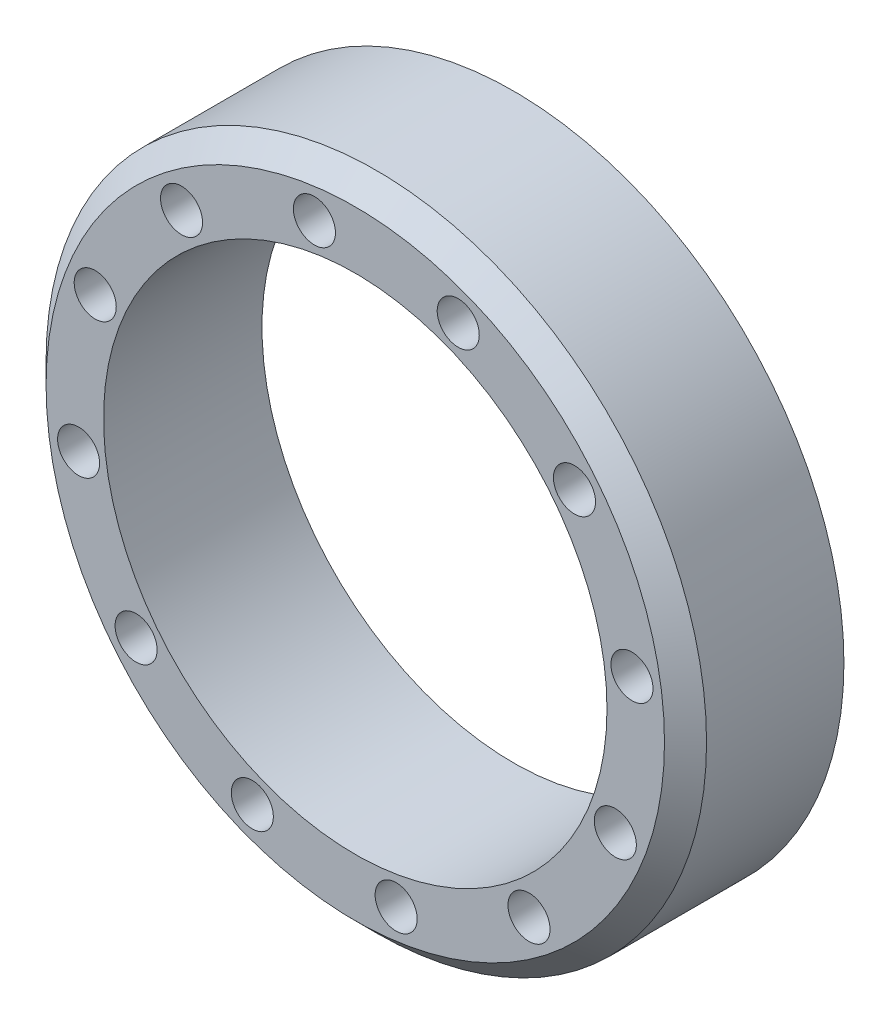
ISO-10303-21;
HEADER;
FILE_DESCRIPTION(('STEP AP214'),'2;1');
FILE_NAME('part.step','',(''),(''),'','','');
FILE_SCHEMA(('AUTOMOTIVE_DESIGN { 1 0 10303 214 1 1 1 1 }'));
ENDSEC;
DATA;
#1=APPLICATION_CONTEXT('core data for automotive mechanical design processes');
#2=APPLICATION_PROTOCOL_DEFINITION('international standard','automotive_design',2000,#1);
#3=PRODUCT_CONTEXT('',#1,'mechanical');
#4=PRODUCT('Part','Part','',(#3));
#5=PRODUCT_RELATED_PRODUCT_CATEGORY('part','',(#4));
#6=PRODUCT_DEFINITION_FORMATION('','',#4);
#7=PRODUCT_DEFINITION_CONTEXT('part definition',#1,'design');
#8=PRODUCT_DEFINITION('design','',#6,#7);
#9=PRODUCT_DEFINITION_SHAPE('','',#8);
#10=(LENGTH_UNIT() NAMED_UNIT(*) SI_UNIT(.MILLI.,.METRE.));
#11=(NAMED_UNIT(*) PLANE_ANGLE_UNIT() SI_UNIT($,.RADIAN.));
#12=(NAMED_UNIT(*) SI_UNIT($,.STERADIAN.) SOLID_ANGLE_UNIT());
#13=UNCERTAINTY_MEASURE_WITH_UNIT(LENGTH_MEASURE(1.E-05),#10,'distance_accuracy_value','');
#14=(GEOMETRIC_REPRESENTATION_CONTEXT(3) GLOBAL_UNCERTAINTY_ASSIGNED_CONTEXT((#13)) GLOBAL_UNIT_ASSIGNED_CONTEXT((#10,
#11,#12)) REPRESENTATION_CONTEXT('',''));
#15=CARTESIAN_POINT('',(0.,0.,0.));
#16=DIRECTION('',(0.,0.,1.));
#17=DIRECTION('',(1.,0.,0.));
#18=AXIS2_PLACEMENT_3D('',#15,#16,#17);
#19=CARTESIAN_POINT('',(5.13813615685674,1294.42321463531,641.616173979208));
#20=DIRECTION('',(0.,0.,1.));
#21=DIRECTION('',(1.,0.,0.));
#22=AXIS2_PLACEMENT_3D('',#19,#20,#21);
#23=CONICAL_SURFACE('',#22,0.,1.02974425869508);
#24=CARTESIAN_POINT('',(5.13813615685674,1294.42321463531,641.616173979208));
#25=VERTEX_POINT('',#24);
#26=VERTEX_LOOP('',#25);
#27=FACE_BOUND('',#26,.T.);
#28=CARTESIAN_POINT('',(5.13813615685674,1294.42321463531,643.050788793234));
#29=DIRECTION('',(0.,0.,1.));
#30=DIRECTION('',(0.,1.,0.));
#31=AXIS2_PLACEMENT_3D('',#28,#29,#30);
#32=CIRCLE('',#31,2.3875999999996);
#33=CARTESIAN_POINT('',(5.13813615685674,1296.81081463531,643.050788793234));
#34=VERTEX_POINT('',#33);
#35=EDGE_CURVE('E70',#34,#34,#32,.F.);
#36=ORIENTED_EDGE('',*,*,#35,.F.);
#37=EDGE_LOOP('',(#36));
#38=FACE_BOUND('',#37,.T.);
#39=ADVANCED_FACE('F17',(#27,#38),#23,.F.);
#40=CARTESIAN_POINT('',(20.2214420238372,1300.95034393688,641.616173979208));
#41=DIRECTION('',(0.,0.,1.));
#42=DIRECTION('',(1.,0.,0.));
#43=AXIS2_PLACEMENT_3D('',#40,#41,#42);
#44=CONICAL_SURFACE('',#43,0.,1.02974425869112);
#45=CARTESIAN_POINT('',(20.2214420238372,1300.95034393688,641.616173979208));
#46=VERTEX_POINT('',#45);
#47=VERTEX_LOOP('',#46);
#48=FACE_BOUND('',#47,.T.);
#49=CARTESIAN_POINT('',(20.2214420238372,1300.95034393688,643.050788793234));
#50=DIRECTION('',(0.,0.,1.));
#51=DIRECTION('',(-0.500000000026422,0.866025403769184,0.));
#52=AXIS2_PLACEMENT_3D('',#49,#50,#51);
#53=CIRCLE('',#52,2.38759999987383);
#54=CARTESIAN_POINT('',(19.0276420238372,1303.01806619081,643.050788793234));
#55=VERTEX_POINT('',#54);
#56=EDGE_CURVE('E72',#55,#55,#53,.F.);
#57=ORIENTED_EDGE('',*,*,#56,.F.);
#58=EDGE_LOOP('',(#57));
#59=FACE_BOUND('',#58,.T.);
#60=ADVANCED_FACE('F66',(#48,#59),#44,.F.);
#61=CARTESIAN_POINT('',(30.020403426942,1314.1446566592,641.616173979208));
#62=DIRECTION('',(0.,0.,1.));
#63=DIRECTION('',(0.,-1.,0.));
#64=AXIS2_PLACEMENT_3D('',#61,#62,#63);
#65=CONICAL_SURFACE('',#64,0.,1.02974425870344);
#66=CARTESIAN_POINT('',(30.020403426942,1314.1446566592,641.616173979208));
#67=VERTEX_POINT('',#66);
#68=VERTEX_LOOP('',#67);
#69=FACE_BOUND('',#68,.T.);
#70=CARTESIAN_POINT('',(30.020403426942,1314.1446566592,643.050788793234));
#71=DIRECTION('',(0.,0.,1.));
#72=DIRECTION('',(-0.866025403782515,0.500000000003332,0.));
#73=AXIS2_PLACEMENT_3D('',#70,#71,#72);
#74=CIRCLE('',#73,2.38759999998369);
#75=CARTESIAN_POINT('',(27.952681172885,1315.3384566592,643.050788793234));
#76=VERTEX_POINT('',#75);
#77=EDGE_CURVE('E75',#76,#76,#74,.F.);
#78=ORIENTED_EDGE('',*,*,#77,.F.);
#79=EDGE_LOOP('',(#78));
#80=FACE_BOUND('',#79,.T.);
#81=ADVANCED_FACE('F160',(#69,#80),#65,.F.);
#82=CARTESIAN_POINT('',(31.9093965715796,1330.47074736383,641.616173979208));
#83=DIRECTION('',(0.,0.,1.));
#84=DIRECTION('',(0.,-1.,0.));
#85=AXIS2_PLACEMENT_3D('',#82,#83,#84);
#86=CONICAL_SURFACE('',#85,0.,1.0297442587086);
#87=CARTESIAN_POINT('',(31.9093965715796,1330.47074736383,641.616173979208));
#88=VERTEX_POINT('',#87);
#89=VERTEX_LOOP('',#88);
#90=FACE_BOUND('',#89,.T.);
#91=CARTESIAN_POINT('',(31.9093965715796,1330.47074736383,643.050788793234));
#92=DIRECTION('',(0.,0.,1.));
#93=DIRECTION('',(-1.,0.,0.));
#94=AXIS2_PLACEMENT_3D('',#91,#92,#93);
#95=CIRCLE('',#94,2.3876);
#96=CARTESIAN_POINT('',(29.5217965715796,1330.47074736383,643.050788793234));
#97=VERTEX_POINT('',#96);
#98=EDGE_CURVE('E152',#97,#97,#95,.F.);
#99=ORIENTED_EDGE('',*,*,#98,.F.);
#100=EDGE_LOOP('',(#99));
#101=FACE_BOUND('',#100,.T.);
#102=ADVANCED_FACE('F162',(#90,#101),#86,.F.);
#103=CARTESIAN_POINT('',(25.382267270096,1345.55405323068,641.616173979208));
#104=DIRECTION('',(0.,0.,1.));
#105=DIRECTION('',(0.,-1.,0.));
#106=AXIS2_PLACEMENT_3D('',#103,#104,#105);
#107=CONICAL_SURFACE('',#106,0.,1.02974425870461);
#108=CARTESIAN_POINT('',(25.382267270096,1345.55405323068,641.616173979208));
#109=VERTEX_POINT('',#108);
#110=VERTEX_LOOP('',#109);
#111=FACE_BOUND('',#110,.T.);
#112=CARTESIAN_POINT('',(25.382267270096,1345.55405323068,643.050788793234));
#113=DIRECTION('',(0.,0.,1.));
#114=DIRECTION('',(-0.866025403784642,-0.499999999999648,0.));
#115=AXIS2_PLACEMENT_3D('',#112,#113,#114);
#116=CIRCLE('',#115,2.38760000000128);
#117=CARTESIAN_POINT('',(23.3145450160186,1344.36025323068,643.050788793234));
#118=VERTEX_POINT('',#117);
#119=EDGE_CURVE('E149',#118,#118,#116,.F.);
#120=ORIENTED_EDGE('',*,*,#119,.F.);
#121=EDGE_LOOP('',(#120));
#122=FACE_BOUND('',#121,.T.);
#123=ADVANCED_FACE('F170',(#111,#122),#107,.F.);
#124=CARTESIAN_POINT('',(12.1879545477379,1355.35301463374,641.616173979208));
#125=DIRECTION('',(0.,0.,1.));
#126=DIRECTION('',(1.,0.,0.));
#127=AXIS2_PLACEMENT_3D('',#124,#125,#126);
#128=CONICAL_SURFACE('',#127,0.,1.02974425869114);
#129=CARTESIAN_POINT('',(12.1879545477378,1355.35301463374,641.616173979208));
#130=VERTEX_POINT('',#129);
#131=VERTEX_LOOP('',#130);
#132=FACE_BOUND('',#131,.T.);
#133=CARTESIAN_POINT('',(12.1879545477379,1355.35301463374,643.050788793234));
#134=DIRECTION('',(0.,0.,1.));
#135=DIRECTION('',(-0.500000000026342,-0.86602540376923,0.));
#136=AXIS2_PLACEMENT_3D('',#133,#134,#135);
#137=CIRCLE('',#136,2.38759999987422);
#138=CARTESIAN_POINT('',(10.9941545477379,1353.28529237981,643.050788793234));
#139=VERTEX_POINT('',#138);
#140=EDGE_CURVE('E146',#139,#139,#137,.F.);
#141=ORIENTED_EDGE('',*,*,#140,.F.);
#142=EDGE_LOOP('',(#141));
#143=FACE_BOUND('',#142,.T.);
#144=ADVANCED_FACE('F269',(#132,#143),#128,.F.);
#145=CARTESIAN_POINT('',(-4.13813615685566,1357.24200777853,641.616173979208));
#146=DIRECTION('',(0.,0.,1.));
#147=DIRECTION('',(1.,0.,0.));
#148=AXIS2_PLACEMENT_3D('',#145,#146,#147);
#149=CONICAL_SURFACE('',#148,0.,1.02974425874);
#150=CARTESIAN_POINT('',(-4.13813615685566,1357.24200777853,641.616173979208));
#151=VERTEX_POINT('',#150);
#152=VERTEX_LOOP('',#151);
#153=FACE_BOUND('',#152,.T.);
#154=CARTESIAN_POINT('',(-4.13813615685566,1357.24200777853,643.050788793234));
#155=DIRECTION('',(0.,0.,1.));
#156=DIRECTION('',(0.,-1.,0.));
#157=AXIS2_PLACEMENT_3D('',#154,#155,#156);
#158=CIRCLE('',#157,2.38760000000027);
#159=CARTESIAN_POINT('',(-4.13813615685566,1354.85440777853,643.050788793234));
#160=VERTEX_POINT('',#159);
#161=EDGE_CURVE('E143',#160,#160,#158,.F.);
#162=ORIENTED_EDGE('',*,*,#161,.F.);
#163=EDGE_LOOP('',(#162));
#164=FACE_BOUND('',#163,.T.);
#165=ADVANCED_FACE('F265',(#153,#164),#149,.F.);
#166=CARTESIAN_POINT('',(-19.2214420238361,1350.71487847696,641.616173979208));
#167=DIRECTION('',(0.,0.,1.));
#168=DIRECTION('',(1.,0.,0.));
#169=AXIS2_PLACEMENT_3D('',#166,#167,#168);
#170=CONICAL_SURFACE('',#169,0.,1.02974425869106);
#171=CARTESIAN_POINT('',(-19.2214420238361,1350.71487847696,641.616173979208));
#172=VERTEX_POINT('',#171);
#173=VERTEX_LOOP('',#172);
#174=FACE_BOUND('',#173,.T.);
#175=CARTESIAN_POINT('',(-19.2214420238361,1350.71487847696,643.050788793234));
#176=DIRECTION('',(0.,0.,1.));
#177=DIRECTION('',(0.499999999980354,-0.866025403795781,0.));
#178=AXIS2_PLACEMENT_3D('',#175,#176,#177);
#179=CIRCLE('',#178,2.38760000009382);
#180=CARTESIAN_POINT('',(-18.0276420238361,1348.64715622277,643.050788793234));
#181=VERTEX_POINT('',#180);
#182=EDGE_CURVE('E140',#181,#181,#179,.F.);
#183=ORIENTED_EDGE('',*,*,#182,.F.);
#184=EDGE_LOOP('',(#183));
#185=FACE_BOUND('',#184,.T.);
#186=ADVANCED_FACE('F261',(#174,#185),#170,.F.);
#187=CARTESIAN_POINT('',(-29.020403426946,1337.52056575464,641.616173979208));
#188=DIRECTION('',(0.,0.,1.));
#189=DIRECTION('',(0.,-1.,0.));
#190=AXIS2_PLACEMENT_3D('',#187,#188,#189);
#191=CONICAL_SURFACE('',#190,0.,1.02974425870345);
#192=CARTESIAN_POINT('',(-29.020403426946,1337.52056575464,641.616173979208));
#193=VERTEX_POINT('',#192);
#194=VERTEX_LOOP('',#193);
#195=FACE_BOUND('',#194,.T.);
#196=CARTESIAN_POINT('',(-29.020403426946,1337.52056575464,643.050788793234));
#197=DIRECTION('',(0.,0.,1.));
#198=DIRECTION('',(0.866025403785135,-0.499999999998793,0.));
#199=AXIS2_PLACEMENT_3D('',#196,#197,#198);
#200=CIRCLE('',#199,2.38760000000581);
#201=CARTESIAN_POINT('',(-26.9526811728636,1336.32676575464,643.050788793234));
#202=VERTEX_POINT('',#201);
#203=EDGE_CURVE('E137',#202,#202,#200,.F.);
#204=ORIENTED_EDGE('',*,*,#203,.F.);
#205=EDGE_LOOP('',(#204));
#206=FACE_BOUND('',#205,.T.);
#207=ADVANCED_FACE('F257',(#195,#206),#191,.F.);
#208=CARTESIAN_POINT('',(-30.9093965715836,1321.19447505001,641.616173979208));
#209=DIRECTION('',(0.,0.,1.));
#210=DIRECTION('',(0.,-1.,0.));
#211=AXIS2_PLACEMENT_3D('',#208,#209,#210);
#212=CONICAL_SURFACE('',#211,0.,1.02974425870859);
#213=CARTESIAN_POINT('',(-30.9093965715836,1321.19447505001,641.616173979208));
#214=VERTEX_POINT('',#213);
#215=VERTEX_LOOP('',#214);
#216=FACE_BOUND('',#215,.T.);
#217=CARTESIAN_POINT('',(-30.9093965715836,1321.19447505001,643.050788793234));
#218=DIRECTION('',(0.,0.,1.));
#219=DIRECTION('',(1.,0.,0.));
#220=AXIS2_PLACEMENT_3D('',#217,#218,#219);
#221=CIRCLE('',#220,2.3876);
#222=CARTESIAN_POINT('',(-28.5217965715836,1321.19447505001,643.050788793234));
#223=VERTEX_POINT('',#222);
#224=EDGE_CURVE('E131',#223,#223,#221,.F.);
#225=ORIENTED_EDGE('',*,*,#224,.F.);
#226=EDGE_LOOP('',(#225));
#227=FACE_BOUND('',#226,.T.);
#228=ADVANCED_FACE('F253',(#216,#227),#212,.F.);
#229=CARTESIAN_POINT('',(-24.3822672700949,1306.1111691829,641.616173979208));
#230=DIRECTION('',(0.,0.,1.));
#231=DIRECTION('',(1.,0.,0.));
#232=AXIS2_PLACEMENT_3D('',#229,#230,#231);
#233=CONICAL_SURFACE('',#232,0.,1.02974425872703);
#234=CARTESIAN_POINT('',(-24.3822672700949,1306.1111691829,641.616173979208));
#235=VERTEX_POINT('',#234);
#236=VERTEX_LOOP('',#235);
#237=FACE_BOUND('',#236,.T.);
#238=CARTESIAN_POINT('',(-24.3822672700949,1306.1111691829,643.050788793234));
#239=DIRECTION('',(0.,0.,1.));
#240=DIRECTION('',(0.866025403784296,0.500000000000248,0.));
#241=AXIS2_PLACEMENT_3D('',#238,#239,#240);
#242=CIRCLE('',#241,2.38759999999931);
#243=CARTESIAN_POINT('',(-22.3145450160201,1307.3049691829,643.050788793234));
#244=VERTEX_POINT('',#243);
#245=EDGE_CURVE('E126',#244,#244,#242,.F.);
#246=ORIENTED_EDGE('',*,*,#245,.F.);
#247=EDGE_LOOP('',(#246));
#248=FACE_BOUND('',#247,.T.);
#249=ADVANCED_FACE('F250',(#237,#248),#233,.F.);
#250=CARTESIAN_POINT('',(-11.1879545477393,1296.31220777985,641.616173979208));
#251=DIRECTION('',(0.,0.,1.));
#252=DIRECTION('',(1.,0.,0.));
#253=AXIS2_PLACEMENT_3D('',#250,#251,#252);
#254=CONICAL_SURFACE('',#253,0.,1.02974425873015);
#255=CARTESIAN_POINT('',(-11.1879545477393,1296.31220777985,641.616173979208));
#256=VERTEX_POINT('',#255);
#257=VERTEX_LOOP('',#256);
#258=FACE_BOUND('',#257,.T.);
#259=CARTESIAN_POINT('',(-11.1879545477393,1296.31220777985,643.050788793234));
#260=DIRECTION('',(0.,0.,1.));
#261=DIRECTION('',(0.499999999980354,0.866025403795781,0.));
#262=AXIS2_PLACEMENT_3D('',#259,#260,#261);
#263=CIRCLE('',#262,2.38760000009382);
#264=CARTESIAN_POINT('',(-9.99415454773932,1298.37993003403,643.050788793234));
#265=VERTEX_POINT('',#264);
#266=EDGE_CURVE('E122',#265,#265,#263,.F.);
#267=ORIENTED_EDGE('',*,*,#266,.F.);
#268=EDGE_LOOP('',(#267));
#269=FACE_BOUND('',#268,.T.);
#270=ADVANCED_FACE('F247',(#258,#269),#254,.F.);
#271=CARTESIAN_POINT('',(5.13813615685674,1294.42321463531,643.050788793234));
#272=DIRECTION('',(0.,0.,1.));
#273=DIRECTION('',(1.,0.,0.));
#274=AXIS2_PLACEMENT_3D('',#271,#272,#273);
#275=CYLINDRICAL_SURFACE('',#274,2.38759999999982);
#276=ORIENTED_EDGE('',*,*,#35,.T.);
#277=EDGE_LOOP('',(#276));
#278=FACE_BOUND('',#277,.T.);
#279=CARTESIAN_POINT('',(5.13813615685674,1294.42321463531,654.150588793234));
#280=DIRECTION('',(0.,0.,1.));
#281=DIRECTION('',(1.,0.,0.));
#282=AXIS2_PLACEMENT_3D('',#279,#280,#281);
#283=CIRCLE('',#282,2.38759999999982);
#284=CARTESIAN_POINT('',(7.52573615685656,1294.42321463531,654.150588793234));
#285=VERTEX_POINT('',#284);
#286=EDGE_CURVE('E117',#285,#285,#283,.F.);
#287=ORIENTED_EDGE('',*,*,#286,.F.);
#288=EDGE_LOOP('',(#287));
#289=FACE_BOUND('',#288,.T.);
#290=ADVANCED_FACE('F243',(#278,#289),#275,.F.);
#291=CARTESIAN_POINT('',(20.2214420238372,1300.95034393688,643.050788793234));
#292=DIRECTION('',(0.,0.,1.));
#293=DIRECTION('',(1.,0.,0.));
#294=AXIS2_PLACEMENT_3D('',#291,#292,#293);
#295=CYLINDRICAL_SURFACE('',#294,2.38759999987383);
#296=ORIENTED_EDGE('',*,*,#56,.T.);
#297=EDGE_LOOP('',(#296));
#298=FACE_BOUND('',#297,.T.);
#299=CARTESIAN_POINT('',(20.2214420238372,1300.95034393688,654.150588793234));
#300=DIRECTION('',(0.,0.,1.));
#301=DIRECTION('',(1.,0.,0.));
#302=AXIS2_PLACEMENT_3D('',#299,#300,#301);
#303=CIRCLE('',#302,2.38759999987383);
#304=CARTESIAN_POINT('',(22.609042023711,1300.95034393688,654.150588793234));
#305=VERTEX_POINT('',#304);
#306=EDGE_CURVE('E115',#305,#305,#303,.F.);
#307=ORIENTED_EDGE('',*,*,#306,.F.);
#308=EDGE_LOOP('',(#307));
#309=FACE_BOUND('',#308,.T.);
#310=ADVANCED_FACE('F240',(#298,#309),#295,.F.);
#311=CARTESIAN_POINT('',(30.020403426942,1314.1446566592,643.050788793234));
#312=DIRECTION('',(0.,0.,1.));
#313=DIRECTION('',(1.,0.,0.));
#314=AXIS2_PLACEMENT_3D('',#311,#312,#313);
#315=CYLINDRICAL_SURFACE('',#314,2.3875999999838);
#316=ORIENTED_EDGE('',*,*,#77,.T.);
#317=EDGE_LOOP('',(#316));
#318=FACE_BOUND('',#317,.T.);
#319=CARTESIAN_POINT('',(30.020403426942,1314.1446566592,654.150588793234));
#320=DIRECTION('',(0.,0.,1.));
#321=DIRECTION('',(1.,0.,0.));
#322=AXIS2_PLACEMENT_3D('',#319,#320,#321);
#323=CIRCLE('',#322,2.3875999999838);
#324=CARTESIAN_POINT('',(32.4080034269258,1314.1446566592,654.150588793234));
#325=VERTEX_POINT('',#324);
#326=EDGE_CURVE('E112',#325,#325,#323,.F.);
#327=ORIENTED_EDGE('',*,*,#326,.F.);
#328=EDGE_LOOP('',(#327));
#329=FACE_BOUND('',#328,.T.);
#330=ADVANCED_FACE('F157',(#318,#329),#315,.F.);
#331=CARTESIAN_POINT('',(31.9093965715796,1330.47074736383,643.050788793234));
#332=DIRECTION('',(0.,0.,1.));
#333=DIRECTION('',(1.,0.,0.));
#334=AXIS2_PLACEMENT_3D('',#331,#332,#333);
#335=CYLINDRICAL_SURFACE('',#334,2.3876);
#336=ORIENTED_EDGE('',*,*,#98,.T.);
#337=EDGE_LOOP('',(#336));
#338=FACE_BOUND('',#337,.T.);
#339=CARTESIAN_POINT('',(31.9093965715796,1330.47074736383,654.150588793234));
#340=DIRECTION('',(0.,0.,1.));
#341=DIRECTION('',(1.,0.,0.));
#342=AXIS2_PLACEMENT_3D('',#339,#340,#341);
#343=CIRCLE('',#342,2.3876);
#344=CARTESIAN_POINT('',(34.2969965715796,1330.47074736383,654.150588793234));
#345=VERTEX_POINT('',#344);
#346=EDGE_CURVE('E109',#345,#345,#343,.F.);
#347=ORIENTED_EDGE('',*,*,#346,.F.);
#348=EDGE_LOOP('',(#347));
#349=FACE_BOUND('',#348,.T.);
#350=ADVANCED_FACE('F233',(#338,#349),#335,.F.);
#351=CARTESIAN_POINT('',(25.382267270096,1345.55405323068,643.050788793234));
#352=DIRECTION('',(0.,0.,1.));
#353=DIRECTION('',(1.,0.,0.));
#354=AXIS2_PLACEMENT_3D('',#351,#352,#353);
#355=CYLINDRICAL_SURFACE('',#354,2.38760000000128);
#356=ORIENTED_EDGE('',*,*,#119,.T.);
#357=EDGE_LOOP('',(#356));
#358=FACE_BOUND('',#357,.T.);
#359=CARTESIAN_POINT('',(25.382267270096,1345.55405323068,654.150588793234));
#360=DIRECTION('',(0.,0.,1.));
#361=DIRECTION('',(1.,0.,0.));
#362=AXIS2_PLACEMENT_3D('',#359,#360,#361);
#363=CIRCLE('',#362,2.38760000000128);
#364=CARTESIAN_POINT('',(27.7698672700972,1345.55405323068,654.150588793234));
#365=VERTEX_POINT('',#364);
#366=EDGE_CURVE('E106',#365,#365,#363,.F.);
#367=ORIENTED_EDGE('',*,*,#366,.F.);
#368=EDGE_LOOP('',(#367));
#369=FACE_BOUND('',#368,.T.);
#370=ADVANCED_FACE('F229',(#358,#369),#355,.F.);
#371=CARTESIAN_POINT('',(12.1879545477379,1355.35301463374,643.050788793234));
#372=DIRECTION('',(0.,0.,1.));
#373=DIRECTION('',(1.,0.,0.));
#374=AXIS2_PLACEMENT_3D('',#371,#372,#373);
#375=CYLINDRICAL_SURFACE('',#374,2.38759999987422);
#376=ORIENTED_EDGE('',*,*,#140,.T.);
#377=EDGE_LOOP('',(#376));
#378=FACE_BOUND('',#377,.T.);
#379=CARTESIAN_POINT('',(12.1879545477379,1355.35301463374,654.150588793234));
#380=DIRECTION('',(0.,0.,1.));
#381=DIRECTION('',(1.,0.,0.));
#382=AXIS2_PLACEMENT_3D('',#379,#380,#381);
#383=CIRCLE('',#382,2.38759999987422);
#384=CARTESIAN_POINT('',(14.5755545476121,1355.35301463374,654.150588793234));
#385=VERTEX_POINT('',#384);
#386=EDGE_CURVE('E103',#385,#385,#383,.F.);
#387=ORIENTED_EDGE('',*,*,#386,.F.);
#388=EDGE_LOOP('',(#387));
#389=FACE_BOUND('',#388,.T.);
#390=ADVANCED_FACE('F225',(#378,#389),#375,.F.);
#391=CARTESIAN_POINT('',(-4.13813615685566,1357.24200777853,643.050788793234));
#392=DIRECTION('',(0.,0.,1.));
#393=DIRECTION('',(1.,0.,0.));
#394=AXIS2_PLACEMENT_3D('',#391,#392,#393);
#395=CYLINDRICAL_SURFACE('',#394,2.38760000000005);
#396=ORIENTED_EDGE('',*,*,#161,.T.);
#397=EDGE_LOOP('',(#396));
#398=FACE_BOUND('',#397,.T.);
#399=CARTESIAN_POINT('',(-4.13813615685566,1357.24200777853,654.150588793234));
#400=DIRECTION('',(0.,0.,1.));
#401=DIRECTION('',(1.,0.,0.));
#402=AXIS2_PLACEMENT_3D('',#399,#400,#401);
#403=CIRCLE('',#402,2.38760000000005);
#404=CARTESIAN_POINT('',(-1.75053615685562,1357.24200777853,654.150588793234));
#405=VERTEX_POINT('',#404);
#406=EDGE_CURVE('E100',#405,#405,#403,.F.);
#407=ORIENTED_EDGE('',*,*,#406,.F.);
#408=EDGE_LOOP('',(#407));
#409=FACE_BOUND('',#408,.T.);
#410=ADVANCED_FACE('F221',(#398,#409),#395,.F.);
#411=CARTESIAN_POINT('',(-19.2214420238361,1350.71487847696,643.050788793234));
#412=DIRECTION('',(0.,0.,1.));
#413=DIRECTION('',(1.,0.,0.));
#414=AXIS2_PLACEMENT_3D('',#411,#412,#413);
#415=CYLINDRICAL_SURFACE('',#414,2.38760000009382);
#416=ORIENTED_EDGE('',*,*,#182,.T.);
#417=EDGE_LOOP('',(#416));
#418=FACE_BOUND('',#417,.T.);
#419=CARTESIAN_POINT('',(-19.2214420238361,1350.71487847696,654.150588793234));
#420=DIRECTION('',(0.,0.,1.));
#421=DIRECTION('',(1.,0.,0.));
#422=AXIS2_PLACEMENT_3D('',#419,#420,#421);
#423=CIRCLE('',#422,2.38760000009382);
#424=CARTESIAN_POINT('',(-16.8338420237423,1350.71487847696,654.150588793234));
#425=VERTEX_POINT('',#424);
#426=EDGE_CURVE('E97',#425,#425,#423,.F.);
#427=ORIENTED_EDGE('',*,*,#426,.F.);
#428=EDGE_LOOP('',(#427));
#429=FACE_BOUND('',#428,.T.);
#430=ADVANCED_FACE('F217',(#418,#429),#415,.F.);
#431=CARTESIAN_POINT('',(-29.020403426946,1337.52056575464,643.050788793234));
#432=DIRECTION('',(0.,0.,1.));
#433=DIRECTION('',(1.,0.,0.));
#434=AXIS2_PLACEMENT_3D('',#431,#432,#433);
#435=CYLINDRICAL_SURFACE('',#434,2.38760000000569);
#436=ORIENTED_EDGE('',*,*,#203,.T.);
#437=EDGE_LOOP('',(#436));
#438=FACE_BOUND('',#437,.T.);
#439=CARTESIAN_POINT('',(-29.020403426946,1337.52056575464,654.150588793234));
#440=DIRECTION('',(0.,0.,1.));
#441=DIRECTION('',(1.,0.,0.));
#442=AXIS2_PLACEMENT_3D('',#439,#440,#441);
#443=CIRCLE('',#442,2.38760000000569);
#444=CARTESIAN_POINT('',(-26.6328034269403,1337.52056575464,654.150588793234));
#445=VERTEX_POINT('',#444);
#446=EDGE_CURVE('E94',#445,#445,#443,.F.);
#447=ORIENTED_EDGE('',*,*,#446,.F.);
#448=EDGE_LOOP('',(#447));
#449=FACE_BOUND('',#448,.T.);
#450=ADVANCED_FACE('F213',(#438,#449),#435,.F.);
#451=CARTESIAN_POINT('',(-30.9093965715836,1321.19447505001,643.050788793234));
#452=DIRECTION('',(0.,0.,1.));
#453=DIRECTION('',(1.,0.,0.));
#454=AXIS2_PLACEMENT_3D('',#451,#452,#453);
#455=CYLINDRICAL_SURFACE('',#454,2.38759999999999);
#456=ORIENTED_EDGE('',*,*,#224,.T.);
#457=EDGE_LOOP('',(#456));
#458=FACE_BOUND('',#457,.T.);
#459=CARTESIAN_POINT('',(-30.9093965715836,1321.19447505001,654.150588793234));
#460=DIRECTION('',(0.,0.,1.));
#461=DIRECTION('',(1.,0.,0.));
#462=AXIS2_PLACEMENT_3D('',#459,#460,#461);
#463=CIRCLE('',#462,2.38759999999999);
#464=CARTESIAN_POINT('',(-28.5217965715836,1321.19447505001,654.150588793234));
#465=VERTEX_POINT('',#464);
#466=EDGE_CURVE('E91',#465,#465,#463,.F.);
#467=ORIENTED_EDGE('',*,*,#466,.F.);
#468=EDGE_LOOP('',(#467));
#469=FACE_BOUND('',#468,.T.);
#470=ADVANCED_FACE('F209',(#458,#469),#455,.F.);
#471=CARTESIAN_POINT('',(-24.3822672700949,1306.1111691829,643.050788793234));
#472=DIRECTION('',(0.,0.,1.));
#473=DIRECTION('',(1.,0.,0.));
#474=AXIS2_PLACEMENT_3D('',#471,#472,#473);
#475=CYLINDRICAL_SURFACE('',#474,2.38759999999931);
#476=ORIENTED_EDGE('',*,*,#245,.T.);
#477=EDGE_LOOP('',(#476));
#478=FACE_BOUND('',#477,.T.);
#479=CARTESIAN_POINT('',(-24.3822672700949,1306.1111691829,654.150588793234));
#480=DIRECTION('',(0.,0.,1.));
#481=DIRECTION('',(1.,0.,0.));
#482=AXIS2_PLACEMENT_3D('',#479,#480,#481);
#483=CIRCLE('',#482,2.38759999999931);
#484=CARTESIAN_POINT('',(-21.9946672700956,1306.1111691829,654.150588793234));
#485=VERTEX_POINT('',#484);
#486=EDGE_CURVE('E88',#485,#485,#483,.F.);
#487=ORIENTED_EDGE('',*,*,#486,.F.);
#488=EDGE_LOOP('',(#487));
#489=FACE_BOUND('',#488,.T.);
#490=ADVANCED_FACE('F204',(#478,#489),#475,.F.);
#491=CARTESIAN_POINT('',(-11.1879545477393,1296.31220777985,643.050788793234));
#492=DIRECTION('',(0.,0.,1.));
#493=DIRECTION('',(1.,0.,0.));
#494=AXIS2_PLACEMENT_3D('',#491,#492,#493);
#495=CYLINDRICAL_SURFACE('',#494,2.38760000009382);
#496=ORIENTED_EDGE('',*,*,#266,.T.);
#497=EDGE_LOOP('',(#496));
#498=FACE_BOUND('',#497,.T.);
#499=CARTESIAN_POINT('',(-11.1879545477393,1296.31220777985,654.150588793234));
#500=DIRECTION('',(0.,0.,1.));
#501=DIRECTION('',(1.,0.,0.));
#502=AXIS2_PLACEMENT_3D('',#499,#500,#501);
#503=CIRCLE('',#502,2.38760000009382);
#504=CARTESIAN_POINT('',(-8.8003545476455,1296.31220777985,654.150588793234));
#505=VERTEX_POINT('',#504);
#506=EDGE_CURVE('E85',#505,#505,#503,.F.);
#507=ORIENTED_EDGE('',*,*,#506,.F.);
#508=EDGE_LOOP('',(#507));
#509=FACE_BOUND('',#508,.T.);
#510=ADVANCED_FACE('F197',(#498,#509),#495,.F.);
#511=CARTESIAN_POINT('',(0.500000000000285,1325.83261120679,654.150588793251));
#512=DIRECTION('',(0.,0.,-1.));
#513=DIRECTION('',(-1.,0.,0.));
#514=AXIS2_PLACEMENT_3D('',#511,#512,#513);
#515=CONICAL_SURFACE('',#514,35.1027999999079,0.785398163392525);
#516=CARTESIAN_POINT('',(0.500000000000032,1325.83261120679,651.762988793234));
#517=DIRECTION('',(0.,0.,1.));
#518=DIRECTION('',(0.,-1.,0.));
#519=AXIS2_PLACEMENT_3D('',#516,#517,#518);
#520=CIRCLE('',#519,37.4904);
#521=CARTESIAN_POINT('',(0.500000000000032,1288.34221120679,651.762988793234));
#522=VERTEX_POINT('',#521);
#523=EDGE_CURVE('E84',#522,#522,#520,.T.);
#524=ORIENTED_EDGE('',*,*,#523,.T.);
#525=EDGE_LOOP('',(#524));
#526=FACE_BOUND('',#525,.T.);
#527=CARTESIAN_POINT('',(0.500000000000032,1325.83261120679,654.150588793251));
#528=DIRECTION('',(0.,0.,-1.));
#529=DIRECTION('',(-1.,0.,0.));
#530=AXIS2_PLACEMENT_3D('',#527,#528,#529);
#531=CIRCLE('',#530,35.1027999999076);
#532=CARTESIAN_POINT('',(-34.6027999999076,1325.83261120679,654.150588793251));
#533=VERTEX_POINT('',#532);
#534=EDGE_CURVE('E21',#533,#533,#531,.F.);
#535=ORIENTED_EDGE('',*,*,#534,.F.);
#536=EDGE_LOOP('',(#535));
#537=FACE_BOUND('',#536,.T.);
#538=ADVANCED_FACE('F194',(#526,#537),#515,.T.);
#539=CARTESIAN_POINT('',(-36.032057425073,1362.33952320679,654.150588793234));
#540=DIRECTION('',(0.,0.,1.));
#541=DIRECTION('',(0.,-1.,0.));
#542=AXIS2_PLACEMENT_3D('',#539,#540,#541);
#543=PLANE('',#542);
#544=ORIENTED_EDGE('',*,*,#506,.T.);
#545=EDGE_LOOP('',(#544));
#546=FACE_BOUND('',#545,.T.);
#547=ORIENTED_EDGE('',*,*,#486,.T.);
#548=EDGE_LOOP('',(#547));
#549=FACE_BOUND('',#548,.T.);
#550=ORIENTED_EDGE('',*,*,#466,.T.);
#551=EDGE_LOOP('',(#550));
#552=FACE_BOUND('',#551,.T.);
#553=ORIENTED_EDGE('',*,*,#446,.T.);
#554=EDGE_LOOP('',(#553));
#555=FACE_BOUND('',#554,.T.);
#556=ORIENTED_EDGE('',*,*,#426,.T.);
#557=EDGE_LOOP('',(#556));
#558=FACE_BOUND('',#557,.T.);
#559=ORIENTED_EDGE('',*,*,#406,.T.);
#560=EDGE_LOOP('',(#559));
#561=FACE_BOUND('',#560,.T.);
#562=ORIENTED_EDGE('',*,*,#386,.T.);
#563=EDGE_LOOP('',(#562));
#564=FACE_BOUND('',#563,.T.);
#565=ORIENTED_EDGE('',*,*,#366,.T.);
#566=EDGE_LOOP('',(#565));
#567=FACE_BOUND('',#566,.T.);
#568=ORIENTED_EDGE('',*,*,#346,.T.);
#569=EDGE_LOOP('',(#568));
#570=FACE_BOUND('',#569,.T.);
#571=ORIENTED_EDGE('',*,*,#326,.T.);
#572=EDGE_LOOP('',(#571));
#573=FACE_BOUND('',#572,.T.);
#574=ORIENTED_EDGE('',*,*,#306,.T.);
#575=EDGE_LOOP('',(#574));
#576=FACE_BOUND('',#575,.T.);
#577=ORIENTED_EDGE('',*,*,#286,.T.);
#578=EDGE_LOOP('',(#577));
#579=FACE_BOUND('',#578,.T.);
#580=CARTESIAN_POINT('',(0.500000000000032,1325.83261120679,654.150588793233));
#581=DIRECTION('',(0.,0.,1.));
#582=DIRECTION('',(1.,0.,0.));
#583=AXIS2_PLACEMENT_3D('',#580,#581,#582);
#584=CIRCLE('',#583,28.5750000000002);
#585=CARTESIAN_POINT('',(29.0750000000003,1325.83261120679,654.150588793233));
#586=VERTEX_POINT('',#585);
#587=EDGE_CURVE('E81',#586,#586,#584,.T.);
#588=ORIENTED_EDGE('',*,*,#587,.F.);
#589=EDGE_LOOP('',(#588));
#590=FACE_BOUND('',#589,.T.);
#591=ORIENTED_EDGE('',*,*,#534,.T.);
#592=EDGE_LOOP('',(#591));
#593=FACE_BOUND('',#592,.T.);
#594=ADVANCED_FACE('F189',(#546,#549,#552,#555,#558,#561,#564,#567,#570,#573,#576,#579,#590,
#593),#543,.T.);
#595=CARTESIAN_POINT('',(0.500000000000032,1325.83261120679,636.167388793234));
#596=DIRECTION('',(0.,0.,1.));
#597=DIRECTION('',(1.,0.,0.));
#598=AXIS2_PLACEMENT_3D('',#595,#596,#597);
#599=CYLINDRICAL_SURFACE('',#598,37.4904);
#600=CARTESIAN_POINT('',(0.500000000000032,1325.83261120679,636.167388793234));
#601=DIRECTION('',(0.,0.,1.));
#602=DIRECTION('',(1.,0.,0.));
#603=AXIS2_PLACEMENT_3D('',#600,#601,#602);
#604=CIRCLE('',#603,37.4904);
#605=CARTESIAN_POINT('',(37.9904000000001,1325.83261120679,636.167388793234));
#606=VERTEX_POINT('',#605);
#607=EDGE_CURVE('E27',#606,#606,#604,.T.);
#608=ORIENTED_EDGE('',*,*,#607,.T.);
#609=EDGE_LOOP('',(#608));
#610=FACE_BOUND('',#609,.T.);
#611=ORIENTED_EDGE('',*,*,#523,.F.);
#612=EDGE_LOOP('',(#611));
#613=FACE_BOUND('',#612,.T.);
#614=ADVANCED_FACE('F180',(#610,#613),#599,.T.);
#615=CARTESIAN_POINT('',(0.500000000000032,1325.83261120679,636.167388793234));
#616=DIRECTION('',(0.,0.,1.));
#617=DIRECTION('',(1.,0.,0.));
#618=AXIS2_PLACEMENT_3D('',#615,#616,#617);
#619=CYLINDRICAL_SURFACE('',#618,28.5750000000002);
#620=ORIENTED_EDGE('',*,*,#587,.T.);
#621=EDGE_LOOP('',(#620));
#622=FACE_BOUND('',#621,.T.);
#623=CARTESIAN_POINT('',(0.500000000000032,1325.83261120679,636.167388793234));
#624=DIRECTION('',(0.,0.,1.));
#625=DIRECTION('',(1.,0.,0.));
#626=AXIS2_PLACEMENT_3D('',#623,#624,#625);
#627=CIRCLE('',#626,28.5750000000002);
#628=CARTESIAN_POINT('',(29.0750000000003,1325.83261120679,636.167388793234));
#629=VERTEX_POINT('',#628);
#630=EDGE_CURVE('E11',#629,#629,#627,.F.);
#631=ORIENTED_EDGE('',*,*,#630,.T.);
#632=EDGE_LOOP('',(#631));
#633=FACE_BOUND('',#632,.T.);
#634=ADVANCED_FACE('F175',(#622,#633),#619,.F.);
#635=CARTESIAN_POINT('',(-38.490016000002,1364.82262720679,636.167388793234));
#636=DIRECTION('',(0.,0.,1.));
#637=DIRECTION('',(0.,-1.,0.));
#638=AXIS2_PLACEMENT_3D('',#635,#636,#637);
#639=PLANE('',#638);
#640=ORIENTED_EDGE('',*,*,#630,.F.);
#641=EDGE_LOOP('',(#640));
#642=FACE_BOUND('',#641,.T.);
#643=ORIENTED_EDGE('',*,*,#607,.F.);
#644=EDGE_LOOP('',(#643));
#645=FACE_BOUND('',#644,.T.);
#646=ADVANCED_FACE('F19',(#642,#645),#639,.F.);
#647=CLOSED_SHELL('',(#39,#60,#81,#102,#123,#144,#165,#186,#207,#228,#249,#270,#290,#310,#330,
#350,#370,#390,#410,#430,#450,#470,#490,#510,#538,#594,#614,#634,#646));
#648=MANIFOLD_SOLID_BREP('B1',#647);
#649=ADVANCED_BREP_SHAPE_REPRESENTATION('',(#18,#648),#14);
#650=SHAPE_DEFINITION_REPRESENTATION(#9,#649);
ENDSEC;
END-ISO-10303-21;
